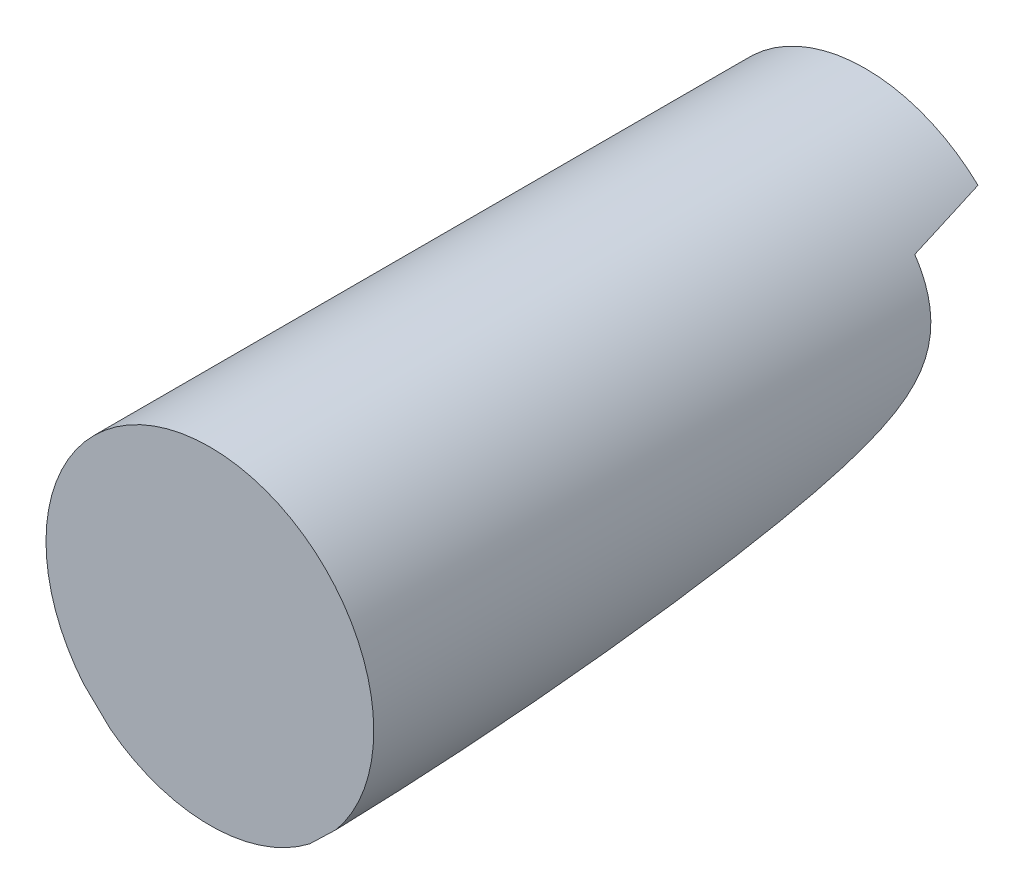
ISO-10303-21;
HEADER;
FILE_DESCRIPTION(('STEP AP214'),'2;1');
FILE_NAME('part.step','',(''),(''),'','','');
FILE_SCHEMA(('AUTOMOTIVE_DESIGN { 1 0 10303 214 1 1 1 1 }'));
ENDSEC;
DATA;
#1=APPLICATION_CONTEXT('core data for automotive mechanical design processes');
#2=APPLICATION_PROTOCOL_DEFINITION('international standard','automotive_design',2000,#1);
#3=PRODUCT_CONTEXT('',#1,'mechanical');
#4=PRODUCT('Part','Part','',(#3));
#5=PRODUCT_RELATED_PRODUCT_CATEGORY('part','',(#4));
#6=PRODUCT_DEFINITION_FORMATION('','',#4);
#7=PRODUCT_DEFINITION_CONTEXT('part definition',#1,'design');
#8=PRODUCT_DEFINITION('design','',#6,#7);
#9=PRODUCT_DEFINITION_SHAPE('','',#8);
#10=(LENGTH_UNIT() NAMED_UNIT(*) SI_UNIT(.MILLI.,.METRE.));
#11=(NAMED_UNIT(*) PLANE_ANGLE_UNIT() SI_UNIT($,.RADIAN.));
#12=(NAMED_UNIT(*) SI_UNIT($,.STERADIAN.) SOLID_ANGLE_UNIT());
#13=UNCERTAINTY_MEASURE_WITH_UNIT(LENGTH_MEASURE(1.E-05),#10,'distance_accuracy_value','');
#14=(GEOMETRIC_REPRESENTATION_CONTEXT(3) GLOBAL_UNCERTAINTY_ASSIGNED_CONTEXT((#13)) GLOBAL_UNIT_ASSIGNED_CONTEXT((#10,
#11,#12)) REPRESENTATION_CONTEXT('',''));
#15=CARTESIAN_POINT('',(0.,0.,0.));
#16=DIRECTION('',(0.,0.,1.));
#17=DIRECTION('',(1.,0.,0.));
#18=AXIS2_PLACEMENT_3D('',#15,#16,#17);
#19=CARTESIAN_POINT('',(0.,0.,10.));
#20=DIRECTION('',(0.,0.,-1.));
#21=DIRECTION('',(-1.,0.,0.));
#22=AXIS2_PLACEMENT_3D('',#19,#20,#21);
#23=CYLINDRICAL_SURFACE('',#22,2.5);
#24=CARTESIAN_POINT('',(0.,0.,0.445133844692623));
#25=DIRECTION('',(0.671597083542654,-0.696882254077915,-0.251619715698681));
#26=DIRECTION('',(-0.174604769284298,0.181178519343388,-0.967826182055288));
#27=AXIS2_PLACEMENT_3D('',#24,#25,#26);
#28=ELLIPSE('',#27,9.9356284266444,2.5);
#29=CARTESIAN_POINT('',(1.71788644762431,1.81627810455027,0.));
#30=VERTEX_POINT('',#29);
#31=CARTESIAN_POINT('',(1.92638307090478,1.59343913097785,1.17366896112728));
#32=VERTEX_POINT('',#31);
#33=EDGE_CURVE('E91',#30,#32,#28,.T.);
#34=ORIENTED_EDGE('',*,*,#33,.F.);
#35=CARTESIAN_POINT('',(0.,0.,0.));
#36=DIRECTION('',(0.,0.,1.));
#37=DIRECTION('',(1.,0.,0.));
#38=AXIS2_PLACEMENT_3D('',#35,#36,#37);
#39=CIRCLE('',#38,2.5);
#40=CARTESIAN_POINT('',(-1.71788644762431,1.81627810455027,0.));
#41=VERTEX_POINT('',#40);
#42=EDGE_CURVE('E116',#30,#41,#39,.T.);
#43=ORIENTED_EDGE('',*,*,#42,.T.);
#44=CARTESIAN_POINT('',(0.,0.,0.445133844692623));
#45=DIRECTION('',(0.671597083542654,0.696882254077915,0.251619715698681));
#46=DIRECTION('',(0.174604769284298,0.181178519343388,-0.967826182055288));
#47=AXIS2_PLACEMENT_3D('',#44,#45,#46);
#48=ELLIPSE('',#47,9.9356284266444,2.5);
#49=CARTESIAN_POINT('',(-1.92638307090478,1.59343913097786,1.17366896112727));
#50=VERTEX_POINT('',#49);
#51=EDGE_CURVE('E224',#41,#50,#48,.T.);
#52=ORIENTED_EDGE('',*,*,#51,.T.);
#53=CARTESIAN_POINT('',(-1.92638307090478,1.59343913097786,1.17366896112728));
#54=CARTESIAN_POINT('',(-1.95385355566543,1.5602342162461,1.17642114488281));
#55=CARTESIAN_POINT('',(-1.98044487143541,1.52633291058047,1.17967415010381));
#56=CARTESIAN_POINT('',(-2.03180328675969,1.45726637724797,1.18751552538915));
#57=CARTESIAN_POINT('',(-2.05656829396451,1.4220997665089,1.19210539816926));
#58=CARTESIAN_POINT('',(-2.10448480904367,1.35019845614727,1.20302678034621));
#59=CARTESIAN_POINT('',(-2.12760829249084,1.31344855149315,1.20938217826835));
#60=CARTESIAN_POINT('',(-2.1717278205056,1.23914013160815,1.22423769038703));
#61=CARTESIAN_POINT('',(-2.19272470353981,1.20158194220187,1.23273695465952));
#62=CARTESIAN_POINT('',(-2.24643861605827,1.09944059856087,1.25927692597194));
#63=CARTESIAN_POINT('',(-2.27706591410185,1.03435123412718,1.27983128785458));
#64=CARTESIAN_POINT('',(-2.33121996102865,0.905674950129554,1.33113952339373));
#65=CARTESIAN_POINT('',(-2.35479198554149,0.842080974199034,1.36182558179752));
#66=CARTESIAN_POINT('',(-2.39527077137473,0.718977779109818,1.43532272468312));
#67=CARTESIAN_POINT('',(-2.41211090273796,0.65951398575408,1.47824814448676));
#68=CARTESIAN_POINT('',(-2.43981588690378,0.548296673885128,1.57476664080705));
#69=CARTESIAN_POINT('',(-2.45066957364022,0.496557694043835,1.62837939984924));
#70=CARTESIAN_POINT('',(-2.46544307310607,0.415611246802628,1.72567141639337));
#71=CARTESIAN_POINT('',(-2.47046620075403,0.38430052178825,1.76750639131585));
#72=CARTESIAN_POINT('',(-2.47893824767965,0.325203257119355,1.85376803588366));
#73=CARTESIAN_POINT('',(-2.48238617857785,0.297418938031505,1.89819631307263));
#74=CARTESIAN_POINT('',(-2.48813643610008,0.244711079374877,1.98908046239816));
#75=CARTESIAN_POINT('',(-2.49043254083789,0.219803624783595,2.03554590292436));
#76=CARTESIAN_POINT('',(-2.494155419446,0.172475445725855,2.12972605705512));
#77=CARTESIAN_POINT('',(-2.49558249134913,0.150053870892692,2.17744033651155));
#78=CARTESIAN_POINT('',(-2.49905187196987,0.0828608145079936,2.32841674870151));
#79=CARTESIAN_POINT('',(-2.49995410531581,0.0416059985614182,2.43325938036342));
#80=CARTESIAN_POINT('',(-2.50004179215571,-0.0352050964063847,2.64503658503671));
#81=CARTESIAN_POINT('',(-2.49922555719054,-0.0707557339262178,2.75197311311017));
#82=CARTESIAN_POINT('',(-2.49640911858784,-0.138132249622012,2.96728219080299));
#83=CARTESIAN_POINT('',(-2.49440594989128,-0.16994855984,3.07565766993657));
#84=CARTESIAN_POINT('',(-2.48949714557891,-0.230937873899731,3.29313463211089));
#85=CARTESIAN_POINT('',(-2.48659138029794,-0.260110497176563,3.40223621725744));
#86=CARTESIAN_POINT('',(-2.47672146477089,-0.345185078522129,3.73154635556386));
#87=CARTESIAN_POINT('',(-2.46862634097525,-0.398256788991062,3.95244799421757));
#88=CARTESIAN_POINT('',(-2.4499923432187,-0.500180947445369,4.39470637146142));
#89=CARTESIAN_POINT('',(-2.43945753311281,-0.549040228486525,4.61606175311389));
#90=CARTESIAN_POINT('',(-2.4163043426062,-0.643259001729472,5.05487989707008));
#91=CARTESIAN_POINT('',(-2.40373061707999,-0.688668173462915,5.27233435820337));
#92=CARTESIAN_POINT('',(-2.37636896787192,-0.777840591406696,5.70744311213089));
#93=CARTESIAN_POINT('',(-2.36158098656108,-0.82160379474139,5.92509740997957));
#94=CARTESIAN_POINT('',(-2.31379556921801,-0.951253557072143,6.57845539467495));
#95=CARTESIAN_POINT('',(-2.27739220482296,-1.03543820286547,7.01425716608626));
#96=CARTESIAN_POINT('',(-2.21560846409525,-1.15892716252726,7.66283924499403));
#97=CARTESIAN_POINT('',(-2.19409776417586,-1.19918807072152,7.87581420934481));
#98=CARTESIAN_POINT('',(-2.14843036614247,-1.2792084748912,8.30157435235707));
#99=CARTESIAN_POINT('',(-2.12427369674725,-1.31896797630355,8.51435953305316));
#100=CARTESIAN_POINT('',(-2.0730839673194,-1.39805035894532,8.93950891189632));
#101=CARTESIAN_POINT('',(-2.04605295166919,-1.43737352882148,9.15187330126389));
#102=CARTESIAN_POINT('',(-1.98874297421956,-1.51566250796985,9.57623780765845));
#103=CARTESIAN_POINT('',(-1.95846387635428,-1.55462830219691,9.78823790904674));
#104=CARTESIAN_POINT('',(-1.92638307090478,-1.59343913097786,10.));
#105=B_SPLINE_CURVE_WITH_KNOTS('',3,(#53,#54,#55,#56,#57,#58,#59,#60,#61,#62,#63,#64,#65,#66,
#67,#68,#69,#70,#71,#72,#73,#74,#75,#76,#77,#78,#79,#80,#81,#82,#83,#84,#85,#86,#87,#88,#89,#90,
#91,#92,#93,#94,#95,#96,#97,#98,#99,#100,#101,#102,#103,#104),.UNSPECIFIED.,.F.,.F.,(4,2,2,2,2,
2,2,2,2,2,2,2,2,2,2,2,2,2,2,2,2,2,2,2,2,4),(0.,0.129543141934664,0.259232463482095,
0.3907700377694,0.522255546441599,0.745820778558113,0.96791895450523,1.19216396735846,
1.41682584522155,1.57409739825807,1.73146749847358,1.88967875882183,2.04783573037504,
2.38549962634427,2.72349544449315,3.06233918526735,3.40123162616366,4.08311852634094,
4.76387765560668,5.43135668965359,6.09885309876062,7.43475717896047,8.0881806248433,
8.74159697931316,9.39455166037105,10.0475337051354),.UNSPECIFIED.);
#106=CARTESIAN_POINT('',(-1.92638307090478,-1.59343913097786,10.));
#107=VERTEX_POINT('',#106);
#108=EDGE_CURVE('E117',#50,#107,#105,.T.);
#109=ORIENTED_EDGE('',*,*,#108,.T.);
#110=CARTESIAN_POINT('',(0.,0.,10.));
#111=DIRECTION('',(0.,0.,1.));
#112=DIRECTION('',(1.,0.,0.));
#113=AXIS2_PLACEMENT_3D('',#110,#111,#112);
#114=CIRCLE('',#113,2.5);
#115=CARTESIAN_POINT('',(1.92638307090478,-1.59343913097786,10.));
#116=VERTEX_POINT('',#115);
#117=EDGE_CURVE('E114',#116,#107,#114,.T.);
#118=ORIENTED_EDGE('',*,*,#117,.F.);
#119=CARTESIAN_POINT('',(1.92638307090478,-1.59343913097786,10.));
#120=CARTESIAN_POINT('',(1.95708194357019,-1.55630300387696,9.79737384832795));
#121=CARTESIAN_POINT('',(1.98612863282211,-1.51902445993696,9.59452906243952));
#122=CARTESIAN_POINT('',(2.04123337821357,-1.44414195972332,9.1885014422308));
#123=CARTESIAN_POINT('',(2.06729155090708,-1.40653801620202,8.98531862140784));
#124=CARTESIAN_POINT('',(2.11673729063666,-1.33096132683893,8.57869875573231));
#125=CARTESIAN_POINT('',(2.14012486330933,-1.29298858177573,8.37526171141722));
#126=CARTESIAN_POINT('',(2.18445352649624,-1.21659739013339,7.96820444546061));
#127=CARTESIAN_POINT('',(2.20539459100512,-1.17817893882137,7.76458422189514));
#128=CARTESIAN_POINT('',(2.2649949346047,-1.06181517073718,7.15189937314402));
#129=CARTESIAN_POINT('',(2.30023542054322,-0.983064378451884,6.74264878128745));
#130=CARTESIAN_POINT('',(2.34701167844932,-0.862198226729894,6.12886972936043));
#131=CARTESIAN_POINT('',(2.3615895614277,-0.821453303428694,5.92429505853582));
#132=CARTESIAN_POINT('',(2.38877561885455,-0.738684722320603,5.5152737639896));
#133=CARTESIAN_POINT('',(2.40138382063831,-0.696661082269461,5.3108271385302));
#134=CARTESIAN_POINT('',(2.41968883528777,-0.62909146562085,4.98934826256008));
#135=CARTESIAN_POINT('',(2.42603987003593,-0.604162087322624,4.87222365300842));
#136=CARTESIAN_POINT('',(2.43809004452008,-0.553525339906687,4.63811081753662));
#137=CARTESIAN_POINT('',(2.44378918597303,-0.527817972838291,4.52112259125807));
#138=CARTESIAN_POINT('',(2.45987667154016,-0.449323935049192,4.17075555301768));
#139=CARTESIAN_POINT('',(2.46927404764726,-0.395096556648073,3.93764202994202));
#140=CARTESIAN_POINT('',(2.48249394490832,-0.297976081980374,3.54659183556746));
#141=CARTESIAN_POINT('',(2.48713948883861,-0.256931595288318,3.38822526070812));
#142=CARTESIAN_POINT('',(2.49463930408678,-0.1695426690026,3.07239495387678));
#143=CARTESIAN_POINT('',(2.49748865727093,-0.123184085056448,2.91493486047507));
#144=CARTESIAN_POINT('',(2.49968728179662,-0.0468537096735877,2.68099105305384));
#145=CARTESIAN_POINT('',(2.50007451980638,-0.0202903588194736,2.60341528846723));
#146=CARTESIAN_POINT('',(2.49990092080385,0.035961633185974,2.4494164799529));
#147=CARTESIAN_POINT('',(2.4993403896033,0.0656492633440735,2.37299307222732));
#148=CARTESIAN_POINT('',(2.49685937844732,0.12925549800061,2.2221608571599));
#149=CARTESIAN_POINT('',(2.49494261375298,0.163162335761545,2.14774712138274));
#150=CARTESIAN_POINT('',(2.48902533035665,0.236917036179611,2.00206049195992));
#151=CARTESIAN_POINT('',(2.48502802948303,0.276755656800687,1.93078293190391));
#152=CARTESIAN_POINT('',(2.47409238347098,0.361315804395955,1.79859731582803));
#153=CARTESIAN_POINT('',(2.46739249761315,0.405461093839524,1.7373121846697));
#154=CARTESIAN_POINT('',(2.44957763397699,0.501955473909814,1.6225024542801));
#155=CARTESIAN_POINT('',(2.43848118982123,0.55426957518815,1.56894654928226));
#156=CARTESIAN_POINT('',(2.40998233344205,0.667369069617808,1.47214977911041));
#157=CARTESIAN_POINT('',(2.39251337314888,0.728239533548057,1.42902606762088));
#158=CARTESIAN_POINT('',(2.35023872759216,0.854891064928335,1.35509607389261));
#159=CARTESIAN_POINT('',(2.32541032972601,0.92068685595317,1.32432862800812));
#160=CARTESIAN_POINT('',(2.26274021222631,1.06654405720794,1.26826969097527));
#161=CARTESIAN_POINT('',(2.22327989460182,1.14678980936585,1.24535800301945));
#162=CARTESIAN_POINT('',(2.13479616181525,1.30416371879039,1.20985860485193));
#163=CARTESIAN_POINT('',(2.08576062436411,1.38128777296054,1.19728408781192));
#164=CARTESIAN_POINT('',(2.0156119772372,1.47924111220468,1.18495461147248));
#165=CARTESIAN_POINT('',(1.998303652488,1.502540613821,1.18230990915462));
#166=CARTESIAN_POINT('',(1.96292314955549,1.54847270178094,1.17758929998064));
#167=CARTESIAN_POINT('',(1.94485405393471,1.57110744745543,1.17551131287607));
#168=CARTESIAN_POINT('',(1.92638307090474,1.59343913097793,1.17366896112814));
#169=B_SPLINE_CURVE_WITH_KNOTS('',3,(#119,#120,#121,#122,#123,#124,#125,#126,#127,#128,#129,
#130,#131,#132,#133,#134,#135,#136,#137,#138,#139,#140,#141,#142,#143,#144,#145,#146,#147,#148,
#149,#150,#151,#152,#153,#154,#155,#156,#157,#158,#159,#160,#161,#162,#163,#164,#165,#166,#167,
#168),.UNSPECIFIED.,.F.,.F.,(4,2,2,2,2,2,2,2,2,2,2,2,2,2,2,2,2,2,2,2,2,2,2,2,4),(0.,
0.624813125171516,1.24960187395456,1.87438930402676,2.49918337472448,3.75380280878628,
4.38109898684776,5.00838645849691,5.36813170768636,5.72787600934615,6.44634493436951,
6.93729876486326,7.42959109852398,7.67553715414481,7.92140386677636,8.1665996476743,
8.41141732235276,8.63819247400272,8.86402165952637,9.0922800439895,9.32125034419252,
9.59670529434622,9.87251125997779,9.95993282437529,10.0470290328461),.UNSPECIFIED.);
#170=EDGE_CURVE('E107',#116,#32,#169,.T.);
#171=ORIENTED_EDGE('',*,*,#170,.T.);
#172=EDGE_LOOP('',(#34,#43,#52,#109,#118,#171));
#173=FACE_BOUND('',#172,.T.);
#174=ADVANCED_FACE('F43',(#173),#23,.T.);
#175=CARTESIAN_POINT('',(0.,0.,10.));
#176=DIRECTION('',(0.,0.,1.));
#177=DIRECTION('',(1.,0.,0.));
#178=AXIS2_PLACEMENT_3D('',#175,#176,#177);
#179=PLANE('',#178);
#180=DIRECTION('',(-0.720048978834203,0.693923243651502,0.));
#181=VECTOR('',#180,1.);
#182=CARTESIAN_POINT('',(-1.72378597678244,-1.78868533900021,10.));
#183=LINE('',#182,#181);
#184=CARTESIAN_POINT('',(-1.52118888266009,-1.98393154702257,10.));
#185=VERTEX_POINT('',#184);
#186=EDGE_CURVE('E226',#185,#107,#183,.T.);
#187=ORIENTED_EDGE('',*,*,#186,.F.);
#188=CARTESIAN_POINT('',(1.52118888266009,-1.98393154702257,10.));
#189=VERTEX_POINT('',#188);
#190=EDGE_CURVE('E229',#185,#189,#114,.T.);
#191=ORIENTED_EDGE('',*,*,#190,.T.);
#192=DIRECTION('',(0.720048978834203,0.693923243651502,0.));
#193=VECTOR('',#192,1.);
#194=CARTESIAN_POINT('',(1.72378597678244,-1.78868533900021,10.));
#195=LINE('',#194,#193);
#196=EDGE_CURVE('E102',#189,#116,#195,.T.);
#197=ORIENTED_EDGE('',*,*,#196,.T.);
#198=ORIENTED_EDGE('',*,*,#117,.T.);
#199=EDGE_LOOP('',(#187,#191,#197,#198));
#200=FACE_BOUND('',#199,.T.);
#201=ADVANCED_FACE('F144',(#200),#179,.T.);
#202=ORIENTED_EDGE('',*,*,#190,.F.);
#203=CARTESIAN_POINT('',(0.,-2.5,7.36909697833318));
#204=VERTEX_POINT('',#203);
#205=EDGE_CURVE('E67',#185,#204,#48,.T.);
#206=ORIENTED_EDGE('',*,*,#205,.T.);
#207=EDGE_CURVE('E104',#189,#204,#28,.T.);
#208=ORIENTED_EDGE('',*,*,#207,.F.);
#209=EDGE_LOOP('',(#202,#206,#208));
#210=FACE_BOUND('',#209,.T.);
#211=ADVANCED_FACE('F45',(#210),#23,.T.);
#212=CARTESIAN_POINT('',(0.,0.,0.));
#213=DIRECTION('',(0.,0.,1.));
#214=DIRECTION('',(1.,0.,0.));
#215=AXIS2_PLACEMENT_3D('',#212,#213,#214);
#216=PLANE('',#215);
#217=DIRECTION('',(0.720048978834203,0.693923243651502,0.));
#218=VECTOR('',#217,1.);
#219=CARTESIAN_POINT('',(-0.0803062509511115,0.0833297263355416,0.));
#220=LINE('',#219,#218);
#221=CARTESIAN_POINT('',(0.,0.160722203491347,0.));
#222=VERTEX_POINT('',#221);
#223=EDGE_CURVE('E53',#222,#30,#220,.T.);
#224=ORIENTED_EDGE('',*,*,#223,.F.);
#225=DIRECTION('',(-0.720048978834203,0.693923243651502,0.));
#226=VECTOR('',#225,1.);
#227=CARTESIAN_POINT('',(0.0803062509511115,0.0833297263355416,0.));
#228=LINE('',#227,#226);
#229=EDGE_CURVE('E12',#222,#41,#228,.T.);
#230=ORIENTED_EDGE('',*,*,#229,.T.);
#231=ORIENTED_EDGE('',*,*,#42,.F.);
#232=EDGE_LOOP('',(#224,#230,#231));
#233=FACE_BOUND('',#232,.T.);
#234=ADVANCED_FACE('F139',(#233),#216,.F.);
#235=CARTESIAN_POINT('',(0.,0.621064801934713,-1.27495807218647));
#236=DIRECTION('',(0.,-0.339606006041832,0.940567786318623));
#237=DIRECTION('',(0.,-0.940567786318623,-0.339606006041832));
#238=AXIS2_PLACEMENT_3D('',#235,#236,#237);
#239=CYLINDRICAL_SURFACE('',#238,2.6);
#240=DIRECTION('',(0.,-0.339606006041832,0.940567786318623));
#241=VECTOR('',#240,1.);
#242=CARTESIAN_POINT('',(1.92638307090478,2.26343951556569,-0.68195422383718));
#243=LINE('',#242,#241);
#244=EDGE_CURVE('E94',#32,#116,#243,.T.);
#245=ORIENTED_EDGE('',*,*,#244,.F.);
#246=ORIENTED_EDGE('',*,*,#170,.F.);
#247=EDGE_LOOP('',(#245,#246));
#248=FACE_BOUND('',#247,.T.);
#249=ADVANCED_FACE('F106',(#248),#239,.F.);
#250=DIRECTION('',(0.,-0.339606006041832,0.940567786318623));
#251=VECTOR('',#250,1.);
#252=CARTESIAN_POINT('',(-1.92638307090478,2.26343951556569,-0.68195422383718));
#253=LINE('',#252,#251);
#254=EDGE_CURVE('E109',#50,#107,#253,.T.);
#255=ORIENTED_EDGE('',*,*,#254,.T.);
#256=ORIENTED_EDGE('',*,*,#108,.F.);
#257=EDGE_LOOP('',(#255,#256));
#258=FACE_BOUND('',#257,.T.);
#259=ADVANCED_FACE('F138',(#258),#239,.F.);
#260=CARTESIAN_POINT('',(0.,0.621064801934713,-1.27495807218647));
#261=DIRECTION('',(0.671597083542654,0.696882254077915,0.251619715698681));
#262=DIRECTION('',(-0.720048978834203,0.693923243651502,0.));
#263=AXIS2_PLACEMENT_3D('',#260,#261,#262);
#264=PLANE('',#263);
#265=ORIENTED_EDGE('',*,*,#186,.T.);
#266=ORIENTED_EDGE('',*,*,#254,.F.);
#267=ORIENTED_EDGE('',*,*,#51,.F.);
#268=ORIENTED_EDGE('',*,*,#229,.F.);
#269=DIRECTION('',(0.,-0.339606006041832,0.940567786318623));
#270=VECTOR('',#269,1.);
#271=CARTESIAN_POINT('',(0.,0.621064801934713,-1.27495807218647));
#272=LINE('',#271,#270);
#273=EDGE_CURVE('E60',#222,#204,#272,.T.);
#274=ORIENTED_EDGE('',*,*,#273,.T.);
#275=ORIENTED_EDGE('',*,*,#205,.F.);
#276=EDGE_LOOP('',(#265,#266,#267,#268,#274,#275));
#277=FACE_BOUND('',#276,.T.);
#278=ADVANCED_FACE('F140',(#277),#264,.F.);
#279=CARTESIAN_POINT('',(0.,0.621064801934713,-1.27495807218647));
#280=DIRECTION('',(0.671597083542654,-0.696882254077915,-0.251619715698681));
#281=DIRECTION('',(0.720048978834203,0.693923243651502,0.));
#282=AXIS2_PLACEMENT_3D('',#279,#280,#281);
#283=PLANE('',#282);
#284=ORIENTED_EDGE('',*,*,#207,.T.);
#285=ORIENTED_EDGE('',*,*,#273,.F.);
#286=ORIENTED_EDGE('',*,*,#223,.T.);
#287=ORIENTED_EDGE('',*,*,#33,.T.);
#288=ORIENTED_EDGE('',*,*,#244,.T.);
#289=ORIENTED_EDGE('',*,*,#196,.F.);
#290=EDGE_LOOP('',(#284,#285,#286,#287,#288,#289));
#291=FACE_BOUND('',#290,.T.);
#292=ADVANCED_FACE('F93',(#291),#283,.T.);
#293=CLOSED_SHELL('',(#174,#201,#211,#234,#249,#259,#278,#292));
#294=MANIFOLD_SOLID_BREP('B2',#293);
#295=ADVANCED_BREP_SHAPE_REPRESENTATION('',(#18,#294),#14);
#296=SHAPE_DEFINITION_REPRESENTATION(#9,#295);
ENDSEC;
END-ISO-10303-21;
